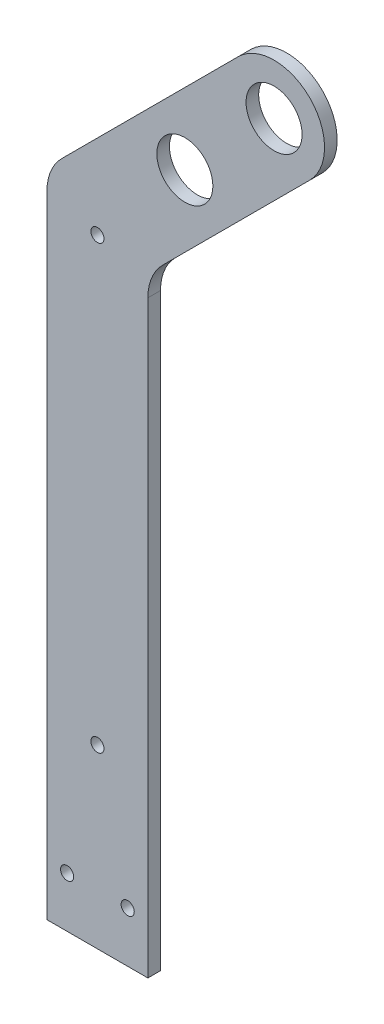
ISO-10303-21;
HEADER;
FILE_DESCRIPTION(('STEP AP214'),'2;1');
FILE_NAME('part.step','',(''),(''),'','','');
FILE_SCHEMA(('AUTOMOTIVE_DESIGN { 1 0 10303 214 1 1 1 1 }'));
ENDSEC;
DATA;
#1=APPLICATION_CONTEXT('core data for automotive mechanical design processes');
#2=APPLICATION_PROTOCOL_DEFINITION('international standard','automotive_design',2000,#1);
#3=PRODUCT_CONTEXT('',#1,'mechanical');
#4=PRODUCT('Part','Part','',(#3));
#5=PRODUCT_RELATED_PRODUCT_CATEGORY('part','',(#4));
#6=PRODUCT_DEFINITION_FORMATION('','',#4);
#7=PRODUCT_DEFINITION_CONTEXT('part definition',#1,'design');
#8=PRODUCT_DEFINITION('design','',#6,#7);
#9=PRODUCT_DEFINITION_SHAPE('','',#8);
#10=(LENGTH_UNIT() NAMED_UNIT(*) SI_UNIT(.MILLI.,.METRE.));
#11=(NAMED_UNIT(*) PLANE_ANGLE_UNIT() SI_UNIT($,.RADIAN.));
#12=(NAMED_UNIT(*) SI_UNIT($,.STERADIAN.) SOLID_ANGLE_UNIT());
#13=UNCERTAINTY_MEASURE_WITH_UNIT(LENGTH_MEASURE(1.E-05),#10,'distance_accuracy_value','');
#14=(GEOMETRIC_REPRESENTATION_CONTEXT(3) GLOBAL_UNCERTAINTY_ASSIGNED_CONTEXT((#13)) GLOBAL_UNIT_ASSIGNED_CONTEXT((#10,
#11,#12)) REPRESENTATION_CONTEXT('',''));
#15=CARTESIAN_POINT('',(0.,0.,0.));
#16=DIRECTION('',(0.,0.,1.));
#17=DIRECTION('',(1.,0.,0.));
#18=AXIS2_PLACEMENT_3D('',#15,#16,#17);
#19=CARTESIAN_POINT('',(-69.9999999999992,-75.,-5.));
#20=DIRECTION('',(0.,0.,1.));
#21=DIRECTION('',(1.,0.,0.));
#22=AXIS2_PLACEMENT_3D('',#19,#20,#21);
#23=CYLINDRICAL_SURFACE('',#22,2.6);
#24=CARTESIAN_POINT('',(-69.9999999999992,-75.,20.));
#25=DIRECTION('',(0.,0.,1.));
#26=DIRECTION('',(0.,-1.,0.));
#27=AXIS2_PLACEMENT_3D('',#24,#25,#26);
#28=CIRCLE('',#27,2.6);
#29=CARTESIAN_POINT('',(-69.9999999999992,-77.6,20.));
#30=VERTEX_POINT('',#29);
#31=EDGE_CURVE('E53',#30,#30,#28,.F.);
#32=ORIENTED_EDGE('',*,*,#31,.T.);
#33=EDGE_LOOP('',(#32));
#34=FACE_BOUND('',#33,.T.);
#35=CARTESIAN_POINT('',(-69.9999999999992,-75.,25.));
#36=DIRECTION('',(0.,0.,1.));
#37=DIRECTION('',(1.,0.,0.));
#38=AXIS2_PLACEMENT_3D('',#35,#36,#37);
#39=CIRCLE('',#38,2.6);
#40=CARTESIAN_POINT('',(-67.3999999999992,-75.,25.));
#41=VERTEX_POINT('',#40);
#42=EDGE_CURVE('E152',#41,#41,#39,.F.);
#43=ORIENTED_EDGE('',*,*,#42,.F.);
#44=EDGE_LOOP('',(#43));
#45=FACE_BOUND('',#44,.T.);
#46=ADVANCED_FACE('F49',(#34,#45),#23,.F.);
#47=CARTESIAN_POINT('',(66.2918686176202,-370.,25.));
#48=DIRECTION('',(0.,0.,1.));
#49=DIRECTION('',(1.,0.,0.));
#50=AXIS2_PLACEMENT_3D('',#47,#48,#49);
#51=PLANE('',#50);
#52=CARTESIAN_POINT('',(0.,0.,25.));
#53=DIRECTION('',(0.,0.,1.));
#54=DIRECTION('',(1.,0.,0.));
#55=AXIS2_PLACEMENT_3D('',#52,#53,#54);
#56=CIRCLE('',#55,11.1);
#57=CARTESIAN_POINT('',(11.1,0.,25.));
#58=VERTEX_POINT('',#57);
#59=EDGE_CURVE('E177',#58,#58,#56,.T.);
#60=ORIENTED_EDGE('',*,*,#59,.F.);
#61=EDGE_LOOP('',(#60));
#62=FACE_BOUND('',#61,.T.);
#63=CARTESIAN_POINT('',(-29.9999999999992,-86.5685424949237,25.));
#64=DIRECTION('',(0.,0.,1.));
#65=DIRECTION('',(1.,0.,0.));
#66=AXIS2_PLACEMENT_3D('',#63,#64,#65);
#67=CIRCLE('',#66,20.);
#68=CARTESIAN_POINT('',(-49.9999999999992,-86.5685424949237,25.));
#69=VERTEX_POINT('',#68);
#70=CARTESIAN_POINT('',(-44.1421356237302,-72.4264068711928,25.));
#71=VERTEX_POINT('',#70);
#72=EDGE_CURVE('E172',#69,#71,#67,.F.);
#73=ORIENTED_EDGE('',*,*,#72,.T.);
#74=DIRECTION('',(-0.707106781186544,-0.707106781186551,0.));
#75=VECTOR('',#74,1.);
#76=CARTESIAN_POINT('',(14.142135623731,-14.1421356237309,25.));
#77=LINE('',#76,#75);
#78=CARTESIAN_POINT('',(14.142135623731,-14.1421356237309,25.));
#79=VERTEX_POINT('',#78);
#80=EDGE_CURVE('E169',#79,#71,#77,.T.);
#81=ORIENTED_EDGE('',*,*,#80,.F.);
#82=CARTESIAN_POINT('',(0.,0.,25.));
#83=DIRECTION('',(0.,0.,1.));
#84=DIRECTION('',(1.,0.,0.));
#85=AXIS2_PLACEMENT_3D('',#82,#83,#84);
#86=CIRCLE('',#85,20.);
#87=CARTESIAN_POINT('',(-14.142135623731,14.1421356237309,25.));
#88=VERTEX_POINT('',#87);
#89=EDGE_CURVE('E167',#79,#88,#86,.T.);
#90=ORIENTED_EDGE('',*,*,#89,.T.);
#91=DIRECTION('',(-0.707106781186544,-0.707106781186551,0.));
#92=VECTOR('',#91,1.);
#93=CARTESIAN_POINT('',(-14.142135623731,14.1421356237309,25.));
#94=LINE('',#93,#92);
#95=CARTESIAN_POINT('',(-84.1421356237303,-55.8578643762691,25.));
#96=VERTEX_POINT('',#95);
#97=EDGE_CURVE('E74',#88,#96,#94,.T.);
#98=ORIENTED_EDGE('',*,*,#97,.T.);
#99=CARTESIAN_POINT('',(-69.9999999999992,-70.,25.));
#100=DIRECTION('',(0.,0.,1.));
#101=DIRECTION('',(1.,0.,0.));
#102=AXIS2_PLACEMENT_3D('',#99,#100,#101);
#103=CIRCLE('',#102,20.);
#104=CARTESIAN_POINT('',(-89.9999999999992,-70.,25.));
#105=VERTEX_POINT('',#104);
#106=EDGE_CURVE('E121',#105,#96,#103,.F.);
#107=ORIENTED_EDGE('',*,*,#106,.F.);
#108=DIRECTION('',(0.,1.,0.));
#109=VECTOR('',#108,1.);
#110=CARTESIAN_POINT('',(-89.9999999999992,-370.,25.));
#111=LINE('',#110,#109);
#112=CARTESIAN_POINT('',(-89.9999999999992,-320.,25.));
#113=VERTEX_POINT('',#112);
#114=EDGE_CURVE('E115',#113,#105,#111,.T.);
#115=ORIENTED_EDGE('',*,*,#114,.F.);
#116=DIRECTION('',(1.,0.,0.));
#117=VECTOR('',#116,1.);
#118=CARTESIAN_POINT('',(-89.9999999999992,-320.,25.));
#119=LINE('',#118,#117);
#120=CARTESIAN_POINT('',(-49.9999999999992,-320.,25.));
#121=VERTEX_POINT('',#120);
#122=EDGE_CURVE('E119',#113,#121,#119,.T.);
#123=ORIENTED_EDGE('',*,*,#122,.T.);
#124=DIRECTION('',(0.,1.,0.));
#125=VECTOR('',#124,1.);
#126=CARTESIAN_POINT('',(-49.9999999999992,-134.57134853142,25.));
#127=LINE('',#126,#125);
#128=EDGE_CURVE('E142',#121,#69,#127,.T.);
#129=ORIENTED_EDGE('',*,*,#128,.T.);
#130=EDGE_LOOP('',(#73,#81,#90,#98,#107,#115,#123,#129));
#131=FACE_BOUND('',#130,.T.);
#132=ORIENTED_EDGE('',*,*,#42,.T.);
#133=EDGE_LOOP('',(#132));
#134=FACE_BOUND('',#133,.T.);
#135=CARTESIAN_POINT('',(-69.9999999999992,-250.,25.));
#136=DIRECTION('',(0.,0.,1.));
#137=DIRECTION('',(1.,0.,0.));
#138=AXIS2_PLACEMENT_3D('',#135,#136,#137);
#139=CIRCLE('',#138,2.6);
#140=CARTESIAN_POINT('',(-67.3999999999992,-250.,25.));
#141=VERTEX_POINT('',#140);
#142=EDGE_CURVE('E154',#141,#141,#139,.F.);
#143=ORIENTED_EDGE('',*,*,#142,.T.);
#144=EDGE_LOOP('',(#143));
#145=FACE_BOUND('',#144,.T.);
#146=CARTESIAN_POINT('',(-57.9999999999992,-300.,25.));
#147=DIRECTION('',(0.,0.,1.));
#148=DIRECTION('',(1.,0.,0.));
#149=AXIS2_PLACEMENT_3D('',#146,#147,#148);
#150=CIRCLE('',#149,2.59999999999999);
#151=CARTESIAN_POINT('',(-55.3999999999992,-300.,25.));
#152=VERTEX_POINT('',#151);
#153=EDGE_CURVE('E157',#152,#152,#150,.F.);
#154=ORIENTED_EDGE('',*,*,#153,.T.);
#155=EDGE_LOOP('',(#154));
#156=FACE_BOUND('',#155,.T.);
#157=CARTESIAN_POINT('',(-81.9999999999992,-300.,25.));
#158=DIRECTION('',(0.,0.,1.));
#159=DIRECTION('',(1.,0.,0.));
#160=AXIS2_PLACEMENT_3D('',#157,#158,#159);
#161=CIRCLE('',#160,2.6);
#162=CARTESIAN_POINT('',(-79.3999999999992,-300.,25.));
#163=VERTEX_POINT('',#162);
#164=EDGE_CURVE('E134',#163,#163,#161,.F.);
#165=ORIENTED_EDGE('',*,*,#164,.T.);
#166=EDGE_LOOP('',(#165));
#167=FACE_BOUND('',#166,.T.);
#168=CARTESIAN_POINT('',(-35.3553390593274,-35.3553390593274,25.));
#169=DIRECTION('',(0.,0.,1.));
#170=DIRECTION('',(1.,0.,0.));
#171=AXIS2_PLACEMENT_3D('',#168,#169,#170);
#172=CIRCLE('',#171,11.1);
#173=CARTESIAN_POINT('',(-24.2553390593274,-35.3553390593274,25.));
#174=VERTEX_POINT('',#173);
#175=EDGE_CURVE('E174',#174,#174,#172,.F.);
#176=ORIENTED_EDGE('',*,*,#175,.T.);
#177=EDGE_LOOP('',(#176));
#178=FACE_BOUND('',#177,.T.);
#179=ADVANCED_FACE('F117',(#62,#131,#134,#145,#156,#167,#178),#51,.T.);
#180=CARTESIAN_POINT('',(66.2918686176202,-389.798510550268,20.));
#181=DIRECTION('',(0.,0.,1.));
#182=DIRECTION('',(0.,-1.,0.));
#183=AXIS2_PLACEMENT_3D('',#180,#181,#182);
#184=PLANE('',#183);
#185=CARTESIAN_POINT('',(0.,0.,20.));
#186=DIRECTION('',(0.,0.,1.));
#187=DIRECTION('',(0.,-1.,0.));
#188=AXIS2_PLACEMENT_3D('',#185,#186,#187);
#189=CIRCLE('',#188,11.1);
#190=CARTESIAN_POINT('',(0.,-11.1,20.));
#191=VERTEX_POINT('',#190);
#192=EDGE_CURVE('E209',#191,#191,#189,.T.);
#193=ORIENTED_EDGE('',*,*,#192,.T.);
#194=EDGE_LOOP('',(#193));
#195=FACE_BOUND('',#194,.T.);
#196=DIRECTION('',(0.,1.,0.));
#197=VECTOR('',#196,1.);
#198=CARTESIAN_POINT('',(-89.9999999999991,-389.798510550268,20.));
#199=LINE('',#198,#197);
#200=CARTESIAN_POINT('',(-89.9999999999992,-320.,20.));
#201=VERTEX_POINT('',#200);
#202=CARTESIAN_POINT('',(-89.9999999999992,-70.,20.));
#203=VERTEX_POINT('',#202);
#204=EDGE_CURVE('E66',#201,#203,#199,.T.);
#205=ORIENTED_EDGE('',*,*,#204,.T.);
#206=CARTESIAN_POINT('',(-69.9999999999992,-70.,20.));
#207=DIRECTION('',(0.,0.,1.));
#208=DIRECTION('',(0.,-1.,0.));
#209=AXIS2_PLACEMENT_3D('',#206,#207,#208);
#210=CIRCLE('',#209,20.);
#211=CARTESIAN_POINT('',(-84.1421356237303,-55.8578643762691,20.));
#212=VERTEX_POINT('',#211);
#213=EDGE_CURVE('E189',#203,#212,#210,.F.);
#214=ORIENTED_EDGE('',*,*,#213,.T.);
#215=DIRECTION('',(-0.707106781186544,-0.707106781186551,0.));
#216=VECTOR('',#215,1.);
#217=CARTESIAN_POINT('',(-14.142135623731,14.1421356237309,20.));
#218=LINE('',#217,#216);
#219=CARTESIAN_POINT('',(-14.142135623731,14.1421356237309,20.));
#220=VERTEX_POINT('',#219);
#221=EDGE_CURVE('E191',#220,#212,#218,.T.);
#222=ORIENTED_EDGE('',*,*,#221,.F.);
#223=CARTESIAN_POINT('',(0.,0.,20.));
#224=DIRECTION('',(0.,0.,1.));
#225=DIRECTION('',(0.,-1.,0.));
#226=AXIS2_PLACEMENT_3D('',#223,#224,#225);
#227=CIRCLE('',#226,20.);
#228=CARTESIAN_POINT('',(14.142135623731,-14.1421356237309,20.));
#229=VERTEX_POINT('',#228);
#230=EDGE_CURVE('E194',#229,#220,#227,.T.);
#231=ORIENTED_EDGE('',*,*,#230,.F.);
#232=DIRECTION('',(-0.707106781186544,-0.707106781186551,0.));
#233=VECTOR('',#232,1.);
#234=CARTESIAN_POINT('',(14.142135623731,-14.1421356237309,20.));
#235=LINE('',#234,#233);
#236=CARTESIAN_POINT('',(-44.1421356237302,-72.4264068711928,20.));
#237=VERTEX_POINT('',#236);
#238=EDGE_CURVE('E197',#229,#237,#235,.T.);
#239=ORIENTED_EDGE('',*,*,#238,.T.);
#240=CARTESIAN_POINT('',(-29.9999999999992,-86.5685424949237,20.));
#241=DIRECTION('',(0.,0.,1.));
#242=DIRECTION('',(0.,-1.,0.));
#243=AXIS2_PLACEMENT_3D('',#240,#241,#242);
#244=CIRCLE('',#243,20.);
#245=CARTESIAN_POINT('',(-49.9999999999992,-86.5685424949237,20.));
#246=VERTEX_POINT('',#245);
#247=EDGE_CURVE('E199',#246,#237,#244,.F.);
#248=ORIENTED_EDGE('',*,*,#247,.F.);
#249=DIRECTION('',(0.,-1.,0.));
#250=VECTOR('',#249,1.);
#251=CARTESIAN_POINT('',(-49.9999999999992,-78.2842712474618,20.));
#252=LINE('',#251,#250);
#253=CARTESIAN_POINT('',(-49.9999999999992,-320.,20.));
#254=VERTEX_POINT('',#253);
#255=EDGE_CURVE('E202',#246,#254,#252,.T.);
#256=ORIENTED_EDGE('',*,*,#255,.T.);
#257=DIRECTION('',(1.,0.,0.));
#258=VECTOR('',#257,1.);
#259=CARTESIAN_POINT('',(-89.9999999999992,-320.,20.));
#260=LINE('',#259,#258);
#261=EDGE_CURVE('E204',#201,#254,#260,.T.);
#262=ORIENTED_EDGE('',*,*,#261,.F.);
#263=EDGE_LOOP('',(#205,#214,#222,#231,#239,#248,#256,#262));
#264=FACE_BOUND('',#263,.T.);
#265=CARTESIAN_POINT('',(-81.9999999999992,-300.,20.));
#266=DIRECTION('',(0.,0.,1.));
#267=DIRECTION('',(0.,-1.,0.));
#268=AXIS2_PLACEMENT_3D('',#265,#266,#267);
#269=CIRCLE('',#268,2.6);
#270=CARTESIAN_POINT('',(-81.9999999999992,-302.6,20.));
#271=VERTEX_POINT('',#270);
#272=EDGE_CURVE('E186',#271,#271,#269,.F.);
#273=ORIENTED_EDGE('',*,*,#272,.F.);
#274=EDGE_LOOP('',(#273));
#275=FACE_BOUND('',#274,.T.);
#276=CARTESIAN_POINT('',(-69.9999999999992,-250.,20.));
#277=DIRECTION('',(0.,0.,1.));
#278=DIRECTION('',(0.,-1.,0.));
#279=AXIS2_PLACEMENT_3D('',#276,#277,#278);
#280=CIRCLE('',#279,2.6);
#281=CARTESIAN_POINT('',(-69.9999999999992,-252.6,20.));
#282=VERTEX_POINT('',#281);
#283=EDGE_CURVE('E180',#282,#282,#280,.F.);
#284=ORIENTED_EDGE('',*,*,#283,.F.);
#285=EDGE_LOOP('',(#284));
#286=FACE_BOUND('',#285,.T.);
#287=ORIENTED_EDGE('',*,*,#31,.F.);
#288=EDGE_LOOP('',(#287));
#289=FACE_BOUND('',#288,.T.);
#290=CARTESIAN_POINT('',(-57.9999999999992,-300.,20.));
#291=DIRECTION('',(0.,0.,1.));
#292=DIRECTION('',(0.,-1.,0.));
#293=AXIS2_PLACEMENT_3D('',#290,#291,#292);
#294=CIRCLE('',#293,2.59999999999999);
#295=CARTESIAN_POINT('',(-57.9999999999992,-302.6,20.));
#296=VERTEX_POINT('',#295);
#297=EDGE_CURVE('E183',#296,#296,#294,.F.);
#298=ORIENTED_EDGE('',*,*,#297,.F.);
#299=EDGE_LOOP('',(#298));
#300=FACE_BOUND('',#299,.T.);
#301=CARTESIAN_POINT('',(-35.3553390593274,-35.3553390593274,20.));
#302=DIRECTION('',(0.,0.,1.));
#303=DIRECTION('',(0.,-1.,0.));
#304=AXIS2_PLACEMENT_3D('',#301,#302,#303);
#305=CIRCLE('',#304,11.1);
#306=CARTESIAN_POINT('',(-35.3553390593274,-46.4553390593274,20.));
#307=VERTEX_POINT('',#306);
#308=EDGE_CURVE('E206',#307,#307,#305,.F.);
#309=ORIENTED_EDGE('',*,*,#308,.F.);
#310=EDGE_LOOP('',(#309));
#311=FACE_BOUND('',#310,.T.);
#312=ADVANCED_FACE('F222',(#195,#264,#275,#286,#289,#300,#311),#184,.F.);
#313=CARTESIAN_POINT('',(-69.9999999999992,-250.,-5.));
#314=DIRECTION('',(0.,0.,1.));
#315=DIRECTION('',(1.,0.,0.));
#316=AXIS2_PLACEMENT_3D('',#313,#314,#315);
#317=CYLINDRICAL_SURFACE('',#316,2.6);
#318=ORIENTED_EDGE('',*,*,#283,.T.);
#319=EDGE_LOOP('',(#318));
#320=FACE_BOUND('',#319,.T.);
#321=ORIENTED_EDGE('',*,*,#142,.F.);
#322=EDGE_LOOP('',(#321));
#323=FACE_BOUND('',#322,.T.);
#324=ADVANCED_FACE('F256',(#320,#323),#317,.F.);
#325=CARTESIAN_POINT('',(-57.9999999999992,-300.,-5.));
#326=DIRECTION('',(0.,0.,1.));
#327=DIRECTION('',(1.,0.,0.));
#328=AXIS2_PLACEMENT_3D('',#325,#326,#327);
#329=CYLINDRICAL_SURFACE('',#328,2.59999999999999);
#330=ORIENTED_EDGE('',*,*,#297,.T.);
#331=EDGE_LOOP('',(#330));
#332=FACE_BOUND('',#331,.T.);
#333=ORIENTED_EDGE('',*,*,#153,.F.);
#334=EDGE_LOOP('',(#333));
#335=FACE_BOUND('',#334,.T.);
#336=ADVANCED_FACE('F259',(#332,#335),#329,.F.);
#337=CARTESIAN_POINT('',(-81.9999999999992,-300.,-5.));
#338=DIRECTION('',(0.,0.,1.));
#339=DIRECTION('',(1.,0.,0.));
#340=AXIS2_PLACEMENT_3D('',#337,#338,#339);
#341=CYLINDRICAL_SURFACE('',#340,2.6);
#342=ORIENTED_EDGE('',*,*,#272,.T.);
#343=EDGE_LOOP('',(#342));
#344=FACE_BOUND('',#343,.T.);
#345=ORIENTED_EDGE('',*,*,#164,.F.);
#346=EDGE_LOOP('',(#345));
#347=FACE_BOUND('',#346,.T.);
#348=ADVANCED_FACE('F241',(#344,#347),#341,.F.);
#349=CARTESIAN_POINT('',(-89.9999999999992,-320.,60.));
#350=DIRECTION('',(0.,1.,0.));
#351=DIRECTION('',(0.,0.,1.));
#352=AXIS2_PLACEMENT_3D('',#349,#350,#351);
#353=PLANE('',#352);
#354=DIRECTION('',(0.,0.,-1.));
#355=VECTOR('',#354,1.);
#356=CARTESIAN_POINT('',(-89.9999999999992,-320.,60.));
#357=LINE('',#356,#355);
#358=EDGE_CURVE('E131',#113,#201,#357,.T.);
#359=ORIENTED_EDGE('',*,*,#358,.T.);
#360=ORIENTED_EDGE('',*,*,#261,.T.);
#361=DIRECTION('',(0.,0.,-1.));
#362=VECTOR('',#361,1.);
#363=CARTESIAN_POINT('',(-49.9999999999992,-320.,60.));
#364=LINE('',#363,#362);
#365=EDGE_CURVE('E133',#121,#254,#364,.T.);
#366=ORIENTED_EDGE('',*,*,#365,.F.);
#367=ORIENTED_EDGE('',*,*,#122,.F.);
#368=EDGE_LOOP('',(#359,#360,#366,#367));
#369=FACE_BOUND('',#368,.T.);
#370=ADVANCED_FACE('F129',(#369),#353,.F.);
#371=CARTESIAN_POINT('',(-69.9999999999992,-70.,60.));
#372=DIRECTION('',(0.,0.,-1.));
#373=DIRECTION('',(-1.,0.,0.));
#374=AXIS2_PLACEMENT_3D('',#371,#372,#373);
#375=CYLINDRICAL_SURFACE('',#374,20.);
#376=ORIENTED_EDGE('',*,*,#213,.F.);
#377=DIRECTION('',(0.,0.,-1.));
#378=VECTOR('',#377,1.);
#379=CARTESIAN_POINT('',(-89.9999999999992,-70.,60.));
#380=LINE('',#379,#378);
#381=EDGE_CURVE('E146',#105,#203,#380,.T.);
#382=ORIENTED_EDGE('',*,*,#381,.F.);
#383=ORIENTED_EDGE('',*,*,#106,.T.);
#384=DIRECTION('',(0.,0.,-1.));
#385=VECTOR('',#384,1.);
#386=CARTESIAN_POINT('',(-84.1421356237303,-55.8578643762691,60.));
#387=LINE('',#386,#385);
#388=EDGE_CURVE('E148',#212,#96,#387,.F.);
#389=ORIENTED_EDGE('',*,*,#388,.F.);
#390=EDGE_LOOP('',(#376,#382,#383,#389));
#391=FACE_BOUND('',#390,.T.);
#392=ADVANCED_FACE('F234',(#391),#375,.T.);
#393=CARTESIAN_POINT('',(-89.9999999999992,-61.7157287525382,60.));
#394=DIRECTION('',(1.,0.,0.));
#395=DIRECTION('',(0.,1.,0.));
#396=AXIS2_PLACEMENT_3D('',#393,#394,#395);
#397=PLANE('',#396);
#398=ORIENTED_EDGE('',*,*,#381,.T.);
#399=ORIENTED_EDGE('',*,*,#204,.F.);
#400=ORIENTED_EDGE('',*,*,#358,.F.);
#401=ORIENTED_EDGE('',*,*,#114,.T.);
#402=EDGE_LOOP('',(#398,#399,#400,#401));
#403=FACE_BOUND('',#402,.T.);
#404=ADVANCED_FACE('F136',(#403),#397,.F.);
#405=CARTESIAN_POINT('',(-14.142135623731,14.1421356237309,60.));
#406=DIRECTION('',(0.707106781186551,-0.707106781186544,0.));
#407=DIRECTION('',(0.707106781186544,0.707106781186551,0.));
#408=AXIS2_PLACEMENT_3D('',#405,#406,#407);
#409=PLANE('',#408);
#410=DIRECTION('',(0.,0.,-1.));
#411=VECTOR('',#410,1.);
#412=CARTESIAN_POINT('',(-14.142135623731,14.1421356237309,60.));
#413=LINE('',#412,#411);
#414=EDGE_CURVE('E137',#88,#220,#413,.T.);
#415=ORIENTED_EDGE('',*,*,#414,.T.);
#416=ORIENTED_EDGE('',*,*,#221,.T.);
#417=ORIENTED_EDGE('',*,*,#388,.T.);
#418=ORIENTED_EDGE('',*,*,#97,.F.);
#419=EDGE_LOOP('',(#415,#416,#417,#418));
#420=FACE_BOUND('',#419,.T.);
#421=ADVANCED_FACE('F231',(#420),#409,.F.);
#422=CARTESIAN_POINT('',(-29.9999999999992,-86.5685424949237,60.));
#423=DIRECTION('',(0.,0.,1.));
#424=DIRECTION('',(1.,0.,0.));
#425=AXIS2_PLACEMENT_3D('',#422,#423,#424);
#426=CYLINDRICAL_SURFACE('',#425,20.);
#427=DIRECTION('',(0.,0.,-1.));
#428=VECTOR('',#427,1.);
#429=CARTESIAN_POINT('',(-49.9999999999992,-86.5685424949237,60.));
#430=LINE('',#429,#428);
#431=EDGE_CURVE('E12',#246,#69,#430,.F.);
#432=ORIENTED_EDGE('',*,*,#431,.F.);
#433=ORIENTED_EDGE('',*,*,#247,.T.);
#434=DIRECTION('',(0.,0.,-1.));
#435=VECTOR('',#434,1.);
#436=CARTESIAN_POINT('',(-44.1421356237302,-72.4264068711928,0.));
#437=LINE('',#436,#435);
#438=EDGE_CURVE('E58',#71,#237,#437,.T.);
#439=ORIENTED_EDGE('',*,*,#438,.F.);
#440=ORIENTED_EDGE('',*,*,#72,.F.);
#441=EDGE_LOOP('',(#432,#433,#439,#440));
#442=FACE_BOUND('',#441,.T.);
#443=ADVANCED_FACE('F51',(#442),#426,.F.);
#444=CARTESIAN_POINT('',(14.142135623731,-14.1421356237309,60.));
#445=DIRECTION('',(0.707106781186551,-0.707106781186544,0.));
#446=DIRECTION('',(0.707106781186544,0.707106781186551,0.));
#447=AXIS2_PLACEMENT_3D('',#444,#445,#446);
#448=PLANE('',#447);
#449=ORIENTED_EDGE('',*,*,#238,.F.);
#450=DIRECTION('',(0.,0.,-1.));
#451=VECTOR('',#450,1.);
#452=CARTESIAN_POINT('',(14.142135623731,-14.1421356237309,60.));
#453=LINE('',#452,#451);
#454=EDGE_CURVE('E140',#79,#229,#453,.T.);
#455=ORIENTED_EDGE('',*,*,#454,.F.);
#456=ORIENTED_EDGE('',*,*,#80,.T.);
#457=ORIENTED_EDGE('',*,*,#438,.T.);
#458=EDGE_LOOP('',(#449,#455,#456,#457));
#459=FACE_BOUND('',#458,.T.);
#460=ADVANCED_FACE('F220',(#459),#448,.T.);
#461=CARTESIAN_POINT('',(0.,0.,60.));
#462=DIRECTION('',(0.,0.,-1.));
#463=DIRECTION('',(-1.,0.,0.));
#464=AXIS2_PLACEMENT_3D('',#461,#462,#463);
#465=CYLINDRICAL_SURFACE('',#464,20.);
#466=ORIENTED_EDGE('',*,*,#454,.T.);
#467=ORIENTED_EDGE('',*,*,#230,.T.);
#468=ORIENTED_EDGE('',*,*,#414,.F.);
#469=ORIENTED_EDGE('',*,*,#89,.F.);
#470=EDGE_LOOP('',(#466,#467,#468,#469));
#471=FACE_BOUND('',#470,.T.);
#472=ADVANCED_FACE('F216',(#471),#465,.T.);
#473=CARTESIAN_POINT('',(-49.9999999999992,-78.2842712474618,60.));
#474=DIRECTION('',(1.,0.,0.));
#475=DIRECTION('',(0.,1.,0.));
#476=AXIS2_PLACEMENT_3D('',#473,#474,#475);
#477=PLANE('',#476);
#478=ORIENTED_EDGE('',*,*,#255,.F.);
#479=ORIENTED_EDGE('',*,*,#431,.T.);
#480=ORIENTED_EDGE('',*,*,#128,.F.);
#481=ORIENTED_EDGE('',*,*,#365,.T.);
#482=EDGE_LOOP('',(#478,#479,#480,#481));
#483=FACE_BOUND('',#482,.T.);
#484=ADVANCED_FACE('F229',(#483),#477,.T.);
#485=CARTESIAN_POINT('',(-35.3553390593274,-35.3553390593274,-40.));
#486=DIRECTION('',(0.,0.,1.));
#487=DIRECTION('',(1.,0.,0.));
#488=AXIS2_PLACEMENT_3D('',#485,#486,#487);
#489=CYLINDRICAL_SURFACE('',#488,11.1);
#490=ORIENTED_EDGE('',*,*,#308,.T.);
#491=EDGE_LOOP('',(#490));
#492=FACE_BOUND('',#491,.T.);
#493=ORIENTED_EDGE('',*,*,#175,.F.);
#494=EDGE_LOOP('',(#493));
#495=FACE_BOUND('',#494,.T.);
#496=ADVANCED_FACE('F267',(#492,#495),#489,.F.);
#497=CARTESIAN_POINT('',(0.,0.,60.));
#498=DIRECTION('',(0.,0.,-1.));
#499=DIRECTION('',(-1.,0.,0.));
#500=AXIS2_PLACEMENT_3D('',#497,#498,#499);
#501=CYLINDRICAL_SURFACE('',#500,11.1);
#502=ORIENTED_EDGE('',*,*,#192,.F.);
#503=EDGE_LOOP('',(#502));
#504=FACE_BOUND('',#503,.T.);
#505=ORIENTED_EDGE('',*,*,#59,.T.);
#506=EDGE_LOOP('',(#505));
#507=FACE_BOUND('',#506,.T.);
#508=ADVANCED_FACE('F270',(#504,#507),#501,.F.);
#509=CLOSED_SHELL('',(#46,#179,#312,#324,#336,#348,#370,#392,#404,#421,#443,#460,#472,#484,#496,#508));
#510=MANIFOLD_SOLID_BREP('B2',#509);
#511=ADVANCED_BREP_SHAPE_REPRESENTATION('',(#18,#510),#14);
#512=SHAPE_DEFINITION_REPRESENTATION(#9,#511);
ENDSEC;
END-ISO-10303-21;
